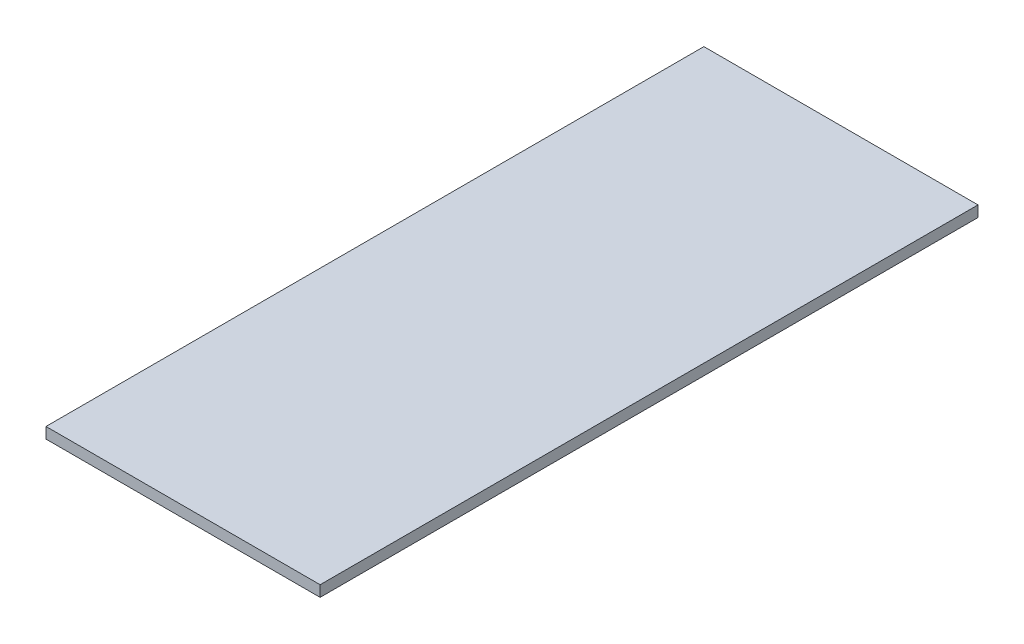
ISO-10303-21;
HEADER;
FILE_DESCRIPTION(('STEP AP214'),'2;1');
FILE_NAME('part.step','',(''),(''),'','','');
FILE_SCHEMA(('AUTOMOTIVE_DESIGN { 1 0 10303 214 1 1 1 1 }'));
ENDSEC;
DATA;
#1=APPLICATION_CONTEXT('core data for automotive mechanical design processes');
#2=APPLICATION_PROTOCOL_DEFINITION('international standard','automotive_design',2000,#1);
#3=PRODUCT_CONTEXT('',#1,'mechanical');
#4=PRODUCT('Part','Part','',(#3));
#5=PRODUCT_RELATED_PRODUCT_CATEGORY('part','',(#4));
#6=PRODUCT_DEFINITION_FORMATION('','',#4);
#7=PRODUCT_DEFINITION_CONTEXT('part definition',#1,'design');
#8=PRODUCT_DEFINITION('design','',#6,#7);
#9=PRODUCT_DEFINITION_SHAPE('','',#8);
#10=(LENGTH_UNIT() NAMED_UNIT(*) SI_UNIT(.MILLI.,.METRE.));
#11=(NAMED_UNIT(*) PLANE_ANGLE_UNIT() SI_UNIT($,.RADIAN.));
#12=(NAMED_UNIT(*) SI_UNIT($,.STERADIAN.) SOLID_ANGLE_UNIT());
#13=UNCERTAINTY_MEASURE_WITH_UNIT(LENGTH_MEASURE(1.E-05),#10,'distance_accuracy_value','');
#14=(GEOMETRIC_REPRESENTATION_CONTEXT(3) GLOBAL_UNCERTAINTY_ASSIGNED_CONTEXT((#13)) GLOBAL_UNIT_ASSIGNED_CONTEXT((#10,
#11,#12)) REPRESENTATION_CONTEXT('',''));
#15=CARTESIAN_POINT('',(0.,0.,0.));
#16=DIRECTION('',(0.,0.,1.));
#17=DIRECTION('',(1.,0.,0.));
#18=AXIS2_PLACEMENT_3D('',#15,#16,#17);
#19=CARTESIAN_POINT('',(-12.5,-1.,30.));
#20=DIRECTION('',(0.,0.,1.));
#21=DIRECTION('',(1.,0.,0.));
#22=AXIS2_PLACEMENT_3D('',#19,#20,#21);
#23=PLANE('',#22);
#24=DIRECTION('',(1.,0.,0.));
#25=VECTOR('',#24,1.);
#26=CARTESIAN_POINT('',(-12.5,0.,30.));
#27=LINE('',#26,#25);
#28=CARTESIAN_POINT('',(-12.5,0.,30.));
#29=VERTEX_POINT('',#28);
#30=CARTESIAN_POINT('',(12.5,0.,30.));
#31=VERTEX_POINT('',#30);
#32=EDGE_CURVE('E117',#29,#31,#27,.T.);
#33=ORIENTED_EDGE('',*,*,#32,.F.);
#34=DIRECTION('',(0.,1.,0.));
#35=VECTOR('',#34,1.);
#36=CARTESIAN_POINT('',(-12.5,-1.,30.));
#37=LINE('',#36,#35);
#38=CARTESIAN_POINT('',(-12.5,-1.,30.));
#39=VERTEX_POINT('',#38);
#40=EDGE_CURVE('E11',#39,#29,#37,.T.);
#41=ORIENTED_EDGE('',*,*,#40,.F.);
#42=DIRECTION('',(1.,0.,0.));
#43=VECTOR('',#42,1.);
#44=CARTESIAN_POINT('',(-12.5,-1.,30.));
#45=LINE('',#44,#43);
#46=CARTESIAN_POINT('',(12.5,-1.,30.));
#47=VERTEX_POINT('',#46);
#48=EDGE_CURVE('E109',#39,#47,#45,.T.);
#49=ORIENTED_EDGE('',*,*,#48,.T.);
#50=DIRECTION('',(0.,1.,0.));
#51=VECTOR('',#50,1.);
#52=CARTESIAN_POINT('',(12.5,-1.,30.));
#53=LINE('',#52,#51);
#54=EDGE_CURVE('E50',#47,#31,#53,.T.);
#55=ORIENTED_EDGE('',*,*,#54,.T.);
#56=EDGE_LOOP('',(#33,#41,#49,#55));
#57=FACE_BOUND('',#56,.T.);
#58=ADVANCED_FACE('F47',(#57),#23,.T.);
#59=CARTESIAN_POINT('',(-12.5,-1.,-30.));
#60=DIRECTION('',(-1.,0.,0.));
#61=DIRECTION('',(0.,0.,1.));
#62=AXIS2_PLACEMENT_3D('',#59,#60,#61);
#63=PLANE('',#62);
#64=DIRECTION('',(0.,0.,1.));
#65=VECTOR('',#64,1.);
#66=CARTESIAN_POINT('',(-12.5,0.,-30.));
#67=LINE('',#66,#65);
#68=CARTESIAN_POINT('',(-12.5,0.,-30.));
#69=VERTEX_POINT('',#68);
#70=EDGE_CURVE('E112',#69,#29,#67,.T.);
#71=ORIENTED_EDGE('',*,*,#70,.F.);
#72=DIRECTION('',(0.,1.,0.));
#73=VECTOR('',#72,1.);
#74=CARTESIAN_POINT('',(-12.5,-1.,-30.));
#75=LINE('',#74,#73);
#76=CARTESIAN_POINT('',(-12.5,-1.,-30.));
#77=VERTEX_POINT('',#76);
#78=EDGE_CURVE('E57',#77,#69,#75,.T.);
#79=ORIENTED_EDGE('',*,*,#78,.F.);
#80=DIRECTION('',(0.,0.,1.));
#81=VECTOR('',#80,1.);
#82=CARTESIAN_POINT('',(-12.5,-1.,-30.));
#83=LINE('',#82,#81);
#84=EDGE_CURVE('E104',#77,#39,#83,.T.);
#85=ORIENTED_EDGE('',*,*,#84,.T.);
#86=ORIENTED_EDGE('',*,*,#40,.T.);
#87=EDGE_LOOP('',(#71,#79,#85,#86));
#88=FACE_BOUND('',#87,.T.);
#89=ADVANCED_FACE('F133',(#88),#63,.T.);
#90=CARTESIAN_POINT('',(-12.5,-1.,-30.));
#91=DIRECTION('',(0.,0.,-1.));
#92=DIRECTION('',(-1.,0.,0.));
#93=AXIS2_PLACEMENT_3D('',#90,#91,#92);
#94=PLANE('',#93);
#95=DIRECTION('',(-1.,0.,0.));
#96=VECTOR('',#95,1.);
#97=CARTESIAN_POINT('',(-12.5,0.,-30.));
#98=LINE('',#97,#96);
#99=CARTESIAN_POINT('',(12.5,0.,-30.));
#100=VERTEX_POINT('',#99);
#101=EDGE_CURVE('E98',#100,#69,#98,.T.);
#102=ORIENTED_EDGE('',*,*,#101,.F.);
#103=DIRECTION('',(0.,1.,0.));
#104=VECTOR('',#103,1.);
#105=CARTESIAN_POINT('',(12.5,-1.,-30.));
#106=LINE('',#105,#104);
#107=CARTESIAN_POINT('',(12.5,-1.,-30.));
#108=VERTEX_POINT('',#107);
#109=EDGE_CURVE('E93',#108,#100,#106,.T.);
#110=ORIENTED_EDGE('',*,*,#109,.F.);
#111=DIRECTION('',(-1.,0.,0.));
#112=VECTOR('',#111,1.);
#113=CARTESIAN_POINT('',(-12.5,-1.,-30.));
#114=LINE('',#113,#112);
#115=EDGE_CURVE('E96',#108,#77,#114,.T.);
#116=ORIENTED_EDGE('',*,*,#115,.T.);
#117=ORIENTED_EDGE('',*,*,#78,.T.);
#118=EDGE_LOOP('',(#102,#110,#116,#117));
#119=FACE_BOUND('',#118,.T.);
#120=ADVANCED_FACE('F95',(#119),#94,.T.);
#121=CARTESIAN_POINT('',(12.5,-1.,-30.));
#122=DIRECTION('',(1.,0.,0.));
#123=DIRECTION('',(0.,0.,-1.));
#124=AXIS2_PLACEMENT_3D('',#121,#122,#123);
#125=PLANE('',#124);
#126=DIRECTION('',(0.,0.,-1.));
#127=VECTOR('',#126,1.);
#128=CARTESIAN_POINT('',(12.5,0.,-30.));
#129=LINE('',#128,#127);
#130=EDGE_CURVE('E121',#31,#100,#129,.T.);
#131=ORIENTED_EDGE('',*,*,#130,.F.);
#132=ORIENTED_EDGE('',*,*,#54,.F.);
#133=DIRECTION('',(0.,0.,-1.));
#134=VECTOR('',#133,1.);
#135=CARTESIAN_POINT('',(12.5,-1.,-30.));
#136=LINE('',#135,#134);
#137=EDGE_CURVE('E103',#47,#108,#136,.T.);
#138=ORIENTED_EDGE('',*,*,#137,.T.);
#139=ORIENTED_EDGE('',*,*,#109,.T.);
#140=EDGE_LOOP('',(#131,#132,#138,#139));
#141=FACE_BOUND('',#140,.T.);
#142=ADVANCED_FACE('F107',(#141),#125,.T.);
#143=CARTESIAN_POINT('',(0.,-1.,0.));
#144=DIRECTION('',(0.,-1.,0.));
#145=DIRECTION('',(0.,0.,-1.));
#146=AXIS2_PLACEMENT_3D('',#143,#144,#145);
#147=PLANE('',#146);
#148=ORIENTED_EDGE('',*,*,#48,.F.);
#149=ORIENTED_EDGE('',*,*,#84,.F.);
#150=ORIENTED_EDGE('',*,*,#115,.F.);
#151=ORIENTED_EDGE('',*,*,#137,.F.);
#152=EDGE_LOOP('',(#148,#149,#150,#151));
#153=FACE_BOUND('',#152,.T.);
#154=ADVANCED_FACE('F102',(#153),#147,.T.);
#155=CARTESIAN_POINT('',(0.,0.,0.));
#156=DIRECTION('',(0.,-1.,0.));
#157=DIRECTION('',(0.,0.,-1.));
#158=AXIS2_PLACEMENT_3D('',#155,#156,#157);
#159=PLANE('',#158);
#160=ORIENTED_EDGE('',*,*,#32,.T.);
#161=ORIENTED_EDGE('',*,*,#130,.T.);
#162=ORIENTED_EDGE('',*,*,#101,.T.);
#163=ORIENTED_EDGE('',*,*,#70,.T.);
#164=EDGE_LOOP('',(#160,#161,#162,#163));
#165=FACE_BOUND('',#164,.T.);
#166=ADVANCED_FACE('F132',(#165),#159,.F.);
#167=CLOSED_SHELL('',(#58,#89,#120,#142,#154,#166));
#168=MANIFOLD_SOLID_BREP('B2',#167);
#169=ADVANCED_BREP_SHAPE_REPRESENTATION('',(#18,#168),#14);
#170=SHAPE_DEFINITION_REPRESENTATION(#9,#169);
ENDSEC;
END-ISO-10303-21;
